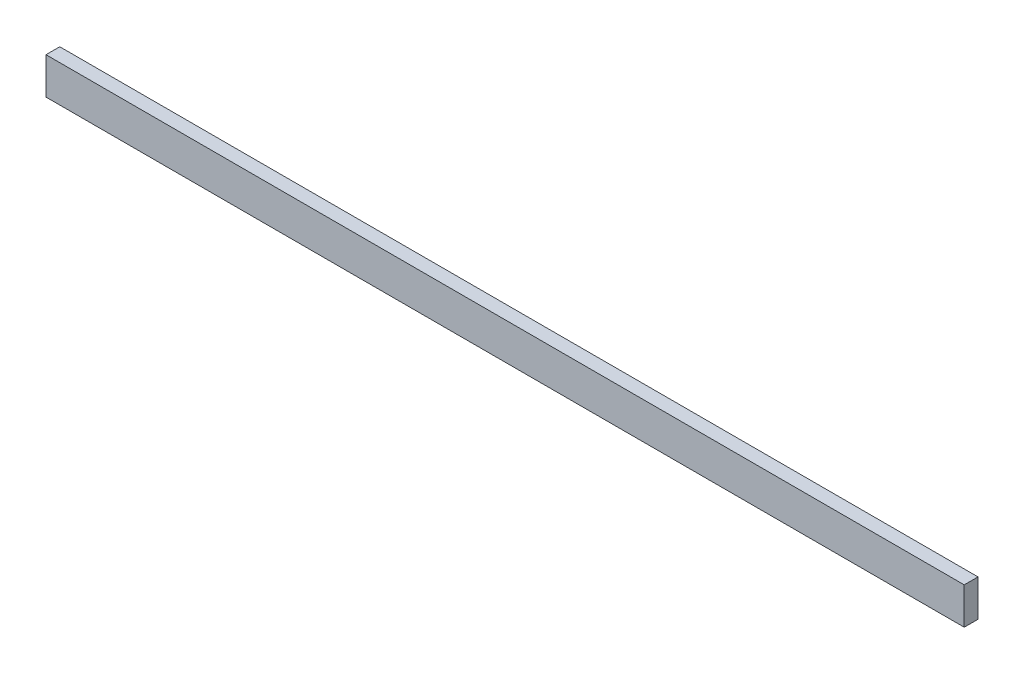
ISO-10303-21;
HEADER;
FILE_DESCRIPTION(('STEP AP214'),'2;1');
FILE_NAME('part.step','',(''),(''),'','','');
FILE_SCHEMA(('AUTOMOTIVE_DESIGN { 1 0 10303 214 1 1 1 1 }'));
ENDSEC;
DATA;
#1=APPLICATION_CONTEXT('core data for automotive mechanical design processes');
#2=APPLICATION_PROTOCOL_DEFINITION('international standard','automotive_design',2000,#1);
#3=PRODUCT_CONTEXT('',#1,'mechanical');
#4=PRODUCT('Part','Part','',(#3));
#5=PRODUCT_RELATED_PRODUCT_CATEGORY('part','',(#4));
#6=PRODUCT_DEFINITION_FORMATION('','',#4);
#7=PRODUCT_DEFINITION_CONTEXT('part definition',#1,'design');
#8=PRODUCT_DEFINITION('design','',#6,#7);
#9=PRODUCT_DEFINITION_SHAPE('','',#8);
#10=(LENGTH_UNIT() NAMED_UNIT(*) SI_UNIT(.MILLI.,.METRE.));
#11=(NAMED_UNIT(*) PLANE_ANGLE_UNIT() SI_UNIT($,.RADIAN.));
#12=(NAMED_UNIT(*) SI_UNIT($,.STERADIAN.) SOLID_ANGLE_UNIT());
#13=UNCERTAINTY_MEASURE_WITH_UNIT(LENGTH_MEASURE(1.E-05),#10,'distance_accuracy_value','');
#14=(GEOMETRIC_REPRESENTATION_CONTEXT(3) GLOBAL_UNCERTAINTY_ASSIGNED_CONTEXT((#13)) GLOBAL_UNIT_ASSIGNED_CONTEXT((#10,
#11,#12)) REPRESENTATION_CONTEXT('',''));
#15=CARTESIAN_POINT('',(0.,0.,0.));
#16=DIRECTION('',(0.,0.,1.));
#17=DIRECTION('',(1.,0.,0.));
#18=AXIS2_PLACEMENT_3D('',#15,#16,#17);
#19=CARTESIAN_POINT('',(5000.,0.,0.));
#20=DIRECTION('',(0.,0.,-1.));
#21=DIRECTION('',(-1.,0.,0.));
#22=AXIS2_PLACEMENT_3D('',#19,#20,#21);
#23=PLANE('',#22);
#24=DIRECTION('',(0.,-1.,0.));
#25=VECTOR('',#24,1.);
#26=CARTESIAN_POINT('',(0.,0.,0.));
#27=LINE('',#26,#25);
#28=CARTESIAN_POINT('',(0.,200.,0.));
#29=VERTEX_POINT('',#28);
#30=CARTESIAN_POINT('',(0.,0.,0.));
#31=VERTEX_POINT('',#30);
#32=EDGE_CURVE('E111',#29,#31,#27,.T.);
#33=ORIENTED_EDGE('',*,*,#32,.T.);
#34=DIRECTION('',(-1.,0.,0.));
#35=VECTOR('',#34,1.);
#36=CARTESIAN_POINT('',(5000.,0.,0.));
#37=LINE('',#36,#35);
#38=CARTESIAN_POINT('',(5000.,0.,0.));
#39=VERTEX_POINT('',#38);
#40=EDGE_CURVE('E11',#39,#31,#37,.T.);
#41=ORIENTED_EDGE('',*,*,#40,.F.);
#42=DIRECTION('',(0.,-1.,0.));
#43=VECTOR('',#42,1.);
#44=CARTESIAN_POINT('',(5000.,0.,0.));
#45=LINE('',#44,#43);
#46=CARTESIAN_POINT('',(5000.,200.,0.));
#47=VERTEX_POINT('',#46);
#48=EDGE_CURVE('E100',#47,#39,#45,.T.);
#49=ORIENTED_EDGE('',*,*,#48,.F.);
#50=DIRECTION('',(-1.,0.,0.));
#51=VECTOR('',#50,1.);
#52=CARTESIAN_POINT('',(5000.,200.,0.));
#53=LINE('',#52,#51);
#54=EDGE_CURVE('E108',#47,#29,#53,.T.);
#55=ORIENTED_EDGE('',*,*,#54,.T.);
#56=EDGE_LOOP('',(#33,#41,#49,#55));
#57=FACE_BOUND('',#56,.T.);
#58=ADVANCED_FACE('F44',(#57),#23,.F.);
#59=CARTESIAN_POINT('',(5000.,0.,0.));
#60=DIRECTION('',(0.,1.,0.));
#61=DIRECTION('',(0.,0.,1.));
#62=AXIS2_PLACEMENT_3D('',#59,#60,#61);
#63=PLANE('',#62);
#64=DIRECTION('',(0.,0.,-1.));
#65=VECTOR('',#64,1.);
#66=CARTESIAN_POINT('',(0.,0.,0.));
#67=LINE('',#66,#65);
#68=CARTESIAN_POINT('',(0.,0.,-75.));
#69=VERTEX_POINT('',#68);
#70=EDGE_CURVE('E105',#31,#69,#67,.T.);
#71=ORIENTED_EDGE('',*,*,#70,.T.);
#72=DIRECTION('',(-1.,0.,0.));
#73=VECTOR('',#72,1.);
#74=CARTESIAN_POINT('',(5000.,0.,-75.));
#75=LINE('',#74,#73);
#76=CARTESIAN_POINT('',(5000.,0.,-75.));
#77=VERTEX_POINT('',#76);
#78=EDGE_CURVE('E53',#77,#69,#75,.T.);
#79=ORIENTED_EDGE('',*,*,#78,.F.);
#80=DIRECTION('',(0.,0.,-1.));
#81=VECTOR('',#80,1.);
#82=CARTESIAN_POINT('',(5000.,0.,0.));
#83=LINE('',#82,#81);
#84=EDGE_CURVE('E95',#39,#77,#83,.T.);
#85=ORIENTED_EDGE('',*,*,#84,.F.);
#86=ORIENTED_EDGE('',*,*,#40,.T.);
#87=EDGE_LOOP('',(#71,#79,#85,#86));
#88=FACE_BOUND('',#87,.T.);
#89=ADVANCED_FACE('F102',(#88),#63,.F.);
#90=CARTESIAN_POINT('',(5000.,0.,-75.));
#91=DIRECTION('',(0.,0.,1.));
#92=DIRECTION('',(1.,0.,0.));
#93=AXIS2_PLACEMENT_3D('',#90,#91,#92);
#94=PLANE('',#93);
#95=DIRECTION('',(0.,1.,0.));
#96=VECTOR('',#95,1.);
#97=CARTESIAN_POINT('',(0.,0.,-75.));
#98=LINE('',#97,#96);
#99=CARTESIAN_POINT('',(0.,200.,-75.));
#100=VERTEX_POINT('',#99);
#101=EDGE_CURVE('E80',#69,#100,#98,.T.);
#102=ORIENTED_EDGE('',*,*,#101,.T.);
#103=DIRECTION('',(-1.,0.,0.));
#104=VECTOR('',#103,1.);
#105=CARTESIAN_POINT('',(5000.,200.,-75.));
#106=LINE('',#105,#104);
#107=CARTESIAN_POINT('',(5000.,200.,-75.));
#108=VERTEX_POINT('',#107);
#109=EDGE_CURVE('E101',#108,#100,#106,.T.);
#110=ORIENTED_EDGE('',*,*,#109,.F.);
#111=DIRECTION('',(0.,1.,0.));
#112=VECTOR('',#111,1.);
#113=CARTESIAN_POINT('',(5000.,0.,-75.));
#114=LINE('',#113,#112);
#115=EDGE_CURVE('E94',#77,#108,#114,.T.);
#116=ORIENTED_EDGE('',*,*,#115,.F.);
#117=ORIENTED_EDGE('',*,*,#78,.T.);
#118=EDGE_LOOP('',(#102,#110,#116,#117));
#119=FACE_BOUND('',#118,.T.);
#120=ADVANCED_FACE('F103',(#119),#94,.F.);
#121=CARTESIAN_POINT('',(5000.,200.,0.));
#122=DIRECTION('',(0.,-1.,0.));
#123=DIRECTION('',(0.,0.,-1.));
#124=AXIS2_PLACEMENT_3D('',#121,#122,#123);
#125=PLANE('',#124);
#126=DIRECTION('',(0.,0.,1.));
#127=VECTOR('',#126,1.);
#128=CARTESIAN_POINT('',(0.,200.,0.));
#129=LINE('',#128,#127);
#130=EDGE_CURVE('E82',#100,#29,#129,.T.);
#131=ORIENTED_EDGE('',*,*,#130,.T.);
#132=ORIENTED_EDGE('',*,*,#54,.F.);
#133=DIRECTION('',(0.,0.,1.));
#134=VECTOR('',#133,1.);
#135=CARTESIAN_POINT('',(5000.,200.,0.));
#136=LINE('',#135,#134);
#137=EDGE_CURVE('E62',#108,#47,#136,.T.);
#138=ORIENTED_EDGE('',*,*,#137,.F.);
#139=ORIENTED_EDGE('',*,*,#109,.T.);
#140=EDGE_LOOP('',(#131,#132,#138,#139));
#141=FACE_BOUND('',#140,.T.);
#142=ADVANCED_FACE('F128',(#141),#125,.F.);
#143=CARTESIAN_POINT('',(5000.,0.,0.));
#144=DIRECTION('',(-1.,0.,0.));
#145=DIRECTION('',(0.,0.,1.));
#146=AXIS2_PLACEMENT_3D('',#143,#144,#145);
#147=PLANE('',#146);
#148=ORIENTED_EDGE('',*,*,#48,.T.);
#149=ORIENTED_EDGE('',*,*,#84,.T.);
#150=ORIENTED_EDGE('',*,*,#115,.T.);
#151=ORIENTED_EDGE('',*,*,#137,.T.);
#152=EDGE_LOOP('',(#148,#149,#150,#151));
#153=FACE_BOUND('',#152,.T.);
#154=ADVANCED_FACE('F93',(#153),#147,.F.);
#155=CARTESIAN_POINT('',(0.,0.,0.));
#156=DIRECTION('',(-1.,0.,0.));
#157=DIRECTION('',(0.,0.,1.));
#158=AXIS2_PLACEMENT_3D('',#155,#156,#157);
#159=PLANE('',#158);
#160=ORIENTED_EDGE('',*,*,#32,.F.);
#161=ORIENTED_EDGE('',*,*,#130,.F.);
#162=ORIENTED_EDGE('',*,*,#101,.F.);
#163=ORIENTED_EDGE('',*,*,#70,.F.);
#164=EDGE_LOOP('',(#160,#161,#162,#163));
#165=FACE_BOUND('',#164,.T.);
#166=ADVANCED_FACE('F129',(#165),#159,.T.);
#167=CLOSED_SHELL('',(#58,#89,#120,#142,#154,#166));
#168=MANIFOLD_SOLID_BREP('B2',#167);
#169=ADVANCED_BREP_SHAPE_REPRESENTATION('',(#18,#168),#14);
#170=SHAPE_DEFINITION_REPRESENTATION(#9,#169);
ENDSEC;
END-ISO-10303-21;
